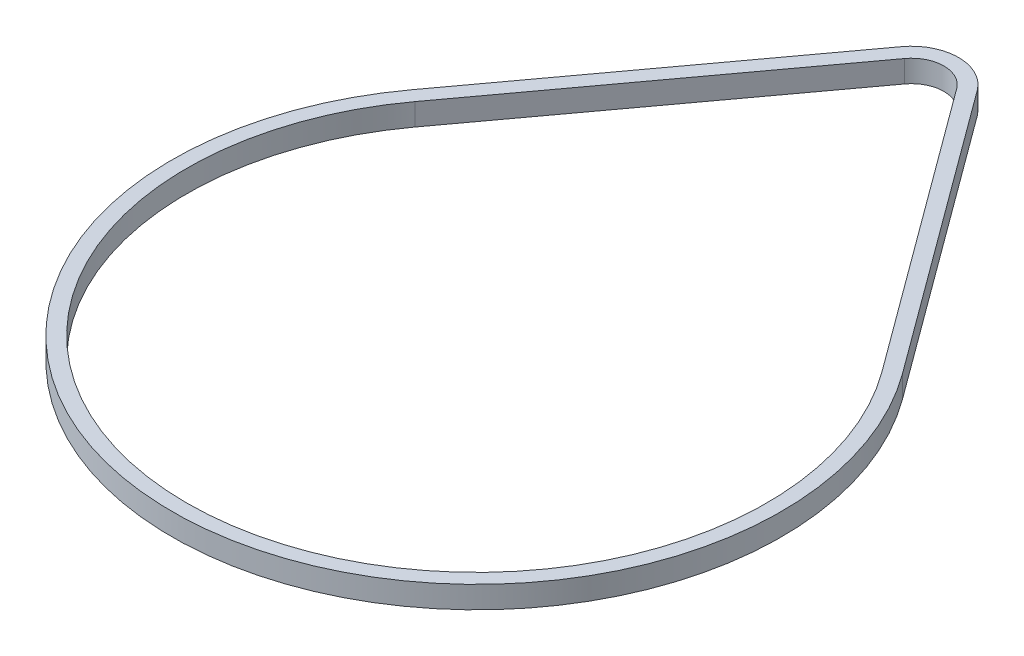
ISO-10303-21;
HEADER;
FILE_DESCRIPTION(('STEP AP214'),'2;1');
FILE_NAME('part.step','',(''),(''),'','','');
FILE_SCHEMA(('AUTOMOTIVE_DESIGN { 1 0 10303 214 1 1 1 1 }'));
ENDSEC;
DATA;
#1=APPLICATION_CONTEXT('core data for automotive mechanical design processes');
#2=APPLICATION_PROTOCOL_DEFINITION('international standard','automotive_design',2000,#1);
#3=PRODUCT_CONTEXT('',#1,'mechanical');
#4=PRODUCT('Part','Part','',(#3));
#5=PRODUCT_RELATED_PRODUCT_CATEGORY('part','',(#4));
#6=PRODUCT_DEFINITION_FORMATION('','',#4);
#7=PRODUCT_DEFINITION_CONTEXT('part definition',#1,'design');
#8=PRODUCT_DEFINITION('design','',#6,#7);
#9=PRODUCT_DEFINITION_SHAPE('','',#8);
#10=(LENGTH_UNIT() NAMED_UNIT(*) SI_UNIT(.MILLI.,.METRE.));
#11=(NAMED_UNIT(*) PLANE_ANGLE_UNIT() SI_UNIT($,.RADIAN.));
#12=(NAMED_UNIT(*) SI_UNIT($,.STERADIAN.) SOLID_ANGLE_UNIT());
#13=UNCERTAINTY_MEASURE_WITH_UNIT(LENGTH_MEASURE(1.E-05),#10,'distance_accuracy_value','');
#14=(GEOMETRIC_REPRESENTATION_CONTEXT(3) GLOBAL_UNCERTAINTY_ASSIGNED_CONTEXT((#13)) GLOBAL_UNIT_ASSIGNED_CONTEXT((#10,
#11,#12)) REPRESENTATION_CONTEXT('',''));
#15=CARTESIAN_POINT('',(0.,0.,0.));
#16=DIRECTION('',(0.,0.,1.));
#17=DIRECTION('',(1.,0.,0.));
#18=AXIS2_PLACEMENT_3D('',#15,#16,#17);
#19=CARTESIAN_POINT('',(0.,-4.5,-88.6925303685816));
#20=DIRECTION('',(0.,1.,0.));
#21=DIRECTION('',(0.,0.,1.));
#22=AXIS2_PLACEMENT_3D('',#19,#20,#21);
#23=PLANE('',#22);
#24=CARTESIAN_POINT('',(0.,-4.5,-88.6925303685816));
#25=DIRECTION('',(0.,-1.,0.));
#26=DIRECTION('',(0.,0.,-1.));
#27=AXIS2_PLACEMENT_3D('',#24,#25,#26);
#28=CIRCLE('',#27,13.1729422181366);
#29=CARTESIAN_POINT('',(10.611444809439,-4.5,-96.4978904332164));
#30=VERTEX_POINT('',#29);
#31=CARTESIAN_POINT('',(-10.611444809439,-4.5,-96.4978904332164));
#32=VERTEX_POINT('',#31);
#33=EDGE_CURVE('E111',#30,#32,#28,.F.);
#34=ORIENTED_EDGE('',*,*,#33,.T.);
#35=DIRECTION('',(0.592529742815413,0.,-0.805548573258684));
#36=VECTOR('',#35,1.);
#37=CARTESIAN_POINT('',(-10.611444809439,-4.5,-96.4978904332164));
#38=LINE('',#37,#36);
#39=CARTESIAN_POINT('',(-95.2793722653035,-4.5,18.6087839402397));
#40=VERTEX_POINT('',#39);
#41=EDGE_CURVE('E103',#40,#32,#38,.T.);
#42=ORIENTED_EDGE('',*,*,#41,.F.);
#43=CARTESIAN_POINT('',(0.,-4.5,88.6925303685816));
#44=DIRECTION('',(0.,-1.,0.));
#45=DIRECTION('',(0.,0.,-1.));
#46=AXIS2_PLACEMENT_3D('',#43,#44,#45);
#47=CIRCLE('',#46,118.278866636024);
#48=CARTESIAN_POINT('',(95.2793722653035,-4.5,18.6087839402397));
#49=VERTEX_POINT('',#48);
#50=EDGE_CURVE('E122',#40,#49,#47,.F.);
#51=ORIENTED_EDGE('',*,*,#50,.T.);
#52=DIRECTION('',(0.592529742815413,0.,0.805548573258684));
#53=VECTOR('',#52,1.);
#54=CARTESIAN_POINT('',(10.611444809439,-4.5,-96.4978904332164));
#55=LINE('',#54,#53);
#56=EDGE_CURVE('E108',#30,#49,#55,.T.);
#57=ORIENTED_EDGE('',*,*,#56,.F.);
#58=EDGE_LOOP('',(#34,#42,#51,#57));
#59=FACE_BOUND('',#58,.T.);
#60=DIRECTION('',(0.592529742815413,0.,0.805548573258684));
#61=VECTOR('',#60,1.);
#62=CARTESIAN_POINT('',(15.4402251769809,-4.5,-100.049750723549));
#63=LINE('',#62,#61);
#64=CARTESIAN_POINT('',(15.4402251769809,-4.5,-100.049750723549));
#65=VERTEX_POINT('',#64);
#66=CARTESIAN_POINT('',(100.108152632845,-4.5,15.056923649907));
#67=VERTEX_POINT('',#66);
#68=EDGE_CURVE('E107',#65,#67,#63,.T.);
#69=ORIENTED_EDGE('',*,*,#68,.T.);
#70=CARTESIAN_POINT('',(0.,-4.5,88.6925303685816));
#71=DIRECTION('',(0.,-1.,0.));
#72=DIRECTION('',(0.,0.,-1.));
#73=AXIS2_PLACEMENT_3D('',#70,#71,#72);
#74=CIRCLE('',#73,124.273266636024);
#75=CARTESIAN_POINT('',(-100.108152632845,-4.5,15.056923649907));
#76=VERTEX_POINT('',#75);
#77=EDGE_CURVE('E91',#76,#67,#74,.F.);
#78=ORIENTED_EDGE('',*,*,#77,.F.);
#79=DIRECTION('',(0.592529742815413,0.,-0.805548573258684));
#80=VECTOR('',#79,1.);
#81=CARTESIAN_POINT('',(-15.4402251769808,-4.5,-100.049750723549));
#82=LINE('',#81,#80);
#83=CARTESIAN_POINT('',(-15.4402251769808,-4.5,-100.049750723549));
#84=VERTEX_POINT('',#83);
#85=EDGE_CURVE('E90',#76,#84,#82,.T.);
#86=ORIENTED_EDGE('',*,*,#85,.T.);
#87=CARTESIAN_POINT('',(0.,-4.5,-88.6925303685816));
#88=DIRECTION('',(0.,-1.,0.));
#89=DIRECTION('',(0.,0.,-1.));
#90=AXIS2_PLACEMENT_3D('',#87,#88,#89);
#91=CIRCLE('',#90,19.1673422181366);
#92=EDGE_CURVE('E19',#65,#84,#91,.F.);
#93=ORIENTED_EDGE('',*,*,#92,.F.);
#94=EDGE_LOOP('',(#69,#78,#86,#93));
#95=FACE_BOUND('',#94,.T.);
#96=ADVANCED_FACE('F16',(#59,#95),#23,.F.);
#97=CARTESIAN_POINT('',(0.,4.5,-88.6925303685816));
#98=DIRECTION('',(0.,-1.,0.));
#99=DIRECTION('',(0.,0.,-1.));
#100=AXIS2_PLACEMENT_3D('',#97,#98,#99);
#101=CYLINDRICAL_SURFACE('',#100,19.1673422181366);
#102=ORIENTED_EDGE('',*,*,#92,.T.);
#103=DIRECTION('',(0.,1.,0.));
#104=VECTOR('',#103,1.);
#105=CARTESIAN_POINT('',(-15.4402251769808,4.5,-100.049750723549));
#106=LINE('',#105,#104);
#107=CARTESIAN_POINT('',(-15.4402251769808,4.5,-100.049750723549));
#108=VERTEX_POINT('',#107);
#109=EDGE_CURVE('E82',#84,#108,#106,.T.);
#110=ORIENTED_EDGE('',*,*,#109,.T.);
#111=CARTESIAN_POINT('',(0.,4.5,-88.6925303685816));
#112=DIRECTION('',(0.,-1.,0.));
#113=DIRECTION('',(0.,0.,-1.));
#114=AXIS2_PLACEMENT_3D('',#111,#112,#113);
#115=CIRCLE('',#114,19.1673422181366);
#116=CARTESIAN_POINT('',(15.4402251769809,4.5,-100.049750723549));
#117=VERTEX_POINT('',#116);
#118=EDGE_CURVE('E120',#117,#108,#115,.F.);
#119=ORIENTED_EDGE('',*,*,#118,.F.);
#120=DIRECTION('',(0.,1.,0.));
#121=VECTOR('',#120,1.);
#122=CARTESIAN_POINT('',(15.4402251769809,4.5,-100.049750723549));
#123=LINE('',#122,#121);
#124=EDGE_CURVE('E85',#117,#65,#123,.F.);
#125=ORIENTED_EDGE('',*,*,#124,.T.);
#126=EDGE_LOOP('',(#102,#110,#119,#125));
#127=FACE_BOUND('',#126,.T.);
#128=ADVANCED_FACE('F80',(#127),#101,.T.);
#129=CARTESIAN_POINT('',(-15.4402251769808,4.5,-100.049750723549));
#130=DIRECTION('',(0.805548573258684,0.,0.592529742815413));
#131=DIRECTION('',(0.592529742815413,0.,-0.805548573258684));
#132=AXIS2_PLACEMENT_3D('',#129,#130,#131);
#133=PLANE('',#132);
#134=DIRECTION('',(0.,-1.,0.));
#135=VECTOR('',#134,1.);
#136=CARTESIAN_POINT('',(-100.108152632845,4.5,15.0569236499071));
#137=LINE('',#136,#135);
#138=CARTESIAN_POINT('',(-100.108152632845,4.5,15.056923649907));
#139=VERTEX_POINT('',#138);
#140=EDGE_CURVE('E101',#139,#76,#137,.T.);
#141=ORIENTED_EDGE('',*,*,#140,.F.);
#142=DIRECTION('',(-0.592529742815413,0.,0.805548573258684));
#143=VECTOR('',#142,1.);
#144=CARTESIAN_POINT('',(-15.4402251769808,4.5,-100.049750723549));
#145=LINE('',#144,#143);
#146=EDGE_CURVE('E97',#108,#139,#145,.T.);
#147=ORIENTED_EDGE('',*,*,#146,.F.);
#148=ORIENTED_EDGE('',*,*,#109,.F.);
#149=ORIENTED_EDGE('',*,*,#85,.F.);
#150=EDGE_LOOP('',(#141,#147,#148,#149));
#151=FACE_BOUND('',#150,.T.);
#152=ADVANCED_FACE('F95',(#151),#133,.F.);
#153=CARTESIAN_POINT('',(0.,4.5,88.6925303685816));
#154=DIRECTION('',(0.,-1.,0.));
#155=DIRECTION('',(0.,0.,-1.));
#156=AXIS2_PLACEMENT_3D('',#153,#154,#155);
#157=CYLINDRICAL_SURFACE('',#156,124.273266636024);
#158=CARTESIAN_POINT('',(0.,4.5,88.6925303685816));
#159=DIRECTION('',(0.,-1.,0.));
#160=DIRECTION('',(0.,0.,-1.));
#161=AXIS2_PLACEMENT_3D('',#158,#159,#160);
#162=CIRCLE('',#161,124.273266636024);
#163=CARTESIAN_POINT('',(100.108152632845,4.5,15.056923649907));
#164=VERTEX_POINT('',#163);
#165=EDGE_CURVE('E116',#139,#164,#162,.F.);
#166=ORIENTED_EDGE('',*,*,#165,.F.);
#167=ORIENTED_EDGE('',*,*,#140,.T.);
#168=ORIENTED_EDGE('',*,*,#77,.T.);
#169=DIRECTION('',(0.,1.,0.));
#170=VECTOR('',#169,1.);
#171=CARTESIAN_POINT('',(100.108152632845,4.5,15.0569236499071));
#172=LINE('',#171,#170);
#173=EDGE_CURVE('E127',#67,#164,#172,.T.);
#174=ORIENTED_EDGE('',*,*,#173,.T.);
#175=EDGE_LOOP('',(#166,#167,#168,#174));
#176=FACE_BOUND('',#175,.T.);
#177=ADVANCED_FACE('F179',(#176),#157,.T.);
#178=CARTESIAN_POINT('',(15.4402251769809,4.5,-100.049750723549));
#179=DIRECTION('',(-0.805548573258684,0.,0.592529742815413));
#180=DIRECTION('',(0.592529742815413,0.,0.805548573258684));
#181=AXIS2_PLACEMENT_3D('',#178,#179,#180);
#182=PLANE('',#181);
#183=ORIENTED_EDGE('',*,*,#124,.F.);
#184=DIRECTION('',(-0.592529742815412,0.,-0.805548573258684));
#185=VECTOR('',#184,1.);
#186=CARTESIAN_POINT('',(100.108152632845,4.5,15.056923649907));
#187=LINE('',#186,#185);
#188=EDGE_CURVE('E119',#164,#117,#187,.T.);
#189=ORIENTED_EDGE('',*,*,#188,.F.);
#190=ORIENTED_EDGE('',*,*,#173,.F.);
#191=ORIENTED_EDGE('',*,*,#68,.F.);
#192=EDGE_LOOP('',(#183,#189,#190,#191));
#193=FACE_BOUND('',#192,.T.);
#194=ADVANCED_FACE('F176',(#193),#182,.F.);
#195=CARTESIAN_POINT('',(-10.611444809439,4.5,-96.4978904332164));
#196=DIRECTION('',(0.805548573258684,0.,0.592529742815413));
#197=DIRECTION('',(0.592529742815413,0.,-0.805548573258684));
#198=AXIS2_PLACEMENT_3D('',#195,#196,#197);
#199=PLANE('',#198);
#200=DIRECTION('',(0.592529742815413,0.,-0.805548573258684));
#201=VECTOR('',#200,1.);
#202=CARTESIAN_POINT('',(-95.2793722653035,4.5,18.6087839402397));
#203=LINE('',#202,#201);
#204=CARTESIAN_POINT('',(-95.2793722653035,4.5,18.6087839402397));
#205=VERTEX_POINT('',#204);
#206=CARTESIAN_POINT('',(-10.611444809439,4.5,-96.4978904332164));
#207=VERTEX_POINT('',#206);
#208=EDGE_CURVE('E115',#205,#207,#203,.T.);
#209=ORIENTED_EDGE('',*,*,#208,.F.);
#210=DIRECTION('',(0.,-1.,0.));
#211=VECTOR('',#210,1.);
#212=CARTESIAN_POINT('',(-95.2793722653035,4.5,18.6087839402398));
#213=LINE('',#212,#211);
#214=EDGE_CURVE('E125',#205,#40,#213,.T.);
#215=ORIENTED_EDGE('',*,*,#214,.T.);
#216=ORIENTED_EDGE('',*,*,#41,.T.);
#217=DIRECTION('',(0.,-1.,0.));
#218=VECTOR('',#217,1.);
#219=CARTESIAN_POINT('',(-10.611444809439,4.5,-96.4978904332164));
#220=LINE('',#219,#218);
#221=EDGE_CURVE('E106',#32,#207,#220,.F.);
#222=ORIENTED_EDGE('',*,*,#221,.T.);
#223=EDGE_LOOP('',(#209,#215,#216,#222));
#224=FACE_BOUND('',#223,.T.);
#225=ADVANCED_FACE('F157',(#224),#199,.T.);
#226=CARTESIAN_POINT('',(0.,4.5,-88.6925303685816));
#227=DIRECTION('',(0.,-1.,0.));
#228=DIRECTION('',(0.,0.,-1.));
#229=AXIS2_PLACEMENT_3D('',#226,#227,#228);
#230=CYLINDRICAL_SURFACE('',#229,13.1729422181366);
#231=DIRECTION('',(0.,1.,0.));
#232=VECTOR('',#231,1.);
#233=CARTESIAN_POINT('',(10.611444809439,4.5,-96.4978904332164));
#234=LINE('',#233,#232);
#235=CARTESIAN_POINT('',(10.611444809439,4.5,-96.4978904332164));
#236=VERTEX_POINT('',#235);
#237=EDGE_CURVE('E110',#236,#30,#234,.F.);
#238=ORIENTED_EDGE('',*,*,#237,.F.);
#239=CARTESIAN_POINT('',(0.,4.5,-88.6925303685816));
#240=DIRECTION('',(0.,-1.,0.));
#241=DIRECTION('',(0.,0.,-1.));
#242=AXIS2_PLACEMENT_3D('',#239,#240,#241);
#243=CIRCLE('',#242,13.1729422181366);
#244=EDGE_CURVE('E113',#207,#236,#243,.T.);
#245=ORIENTED_EDGE('',*,*,#244,.F.);
#246=ORIENTED_EDGE('',*,*,#221,.F.);
#247=ORIENTED_EDGE('',*,*,#33,.F.);
#248=EDGE_LOOP('',(#238,#245,#246,#247));
#249=FACE_BOUND('',#248,.T.);
#250=ADVANCED_FACE('F153',(#249),#230,.F.);
#251=CARTESIAN_POINT('',(10.611444809439,4.5,-96.4978904332164));
#252=DIRECTION('',(-0.805548573258684,0.,0.592529742815413));
#253=DIRECTION('',(0.592529742815413,0.,0.805548573258684));
#254=AXIS2_PLACEMENT_3D('',#251,#252,#253);
#255=PLANE('',#254);
#256=DIRECTION('',(0.592529742815412,0.,0.805548573258684));
#257=VECTOR('',#256,1.);
#258=CARTESIAN_POINT('',(10.611444809439,4.5,-96.4978904332164));
#259=LINE('',#258,#257);
#260=CARTESIAN_POINT('',(95.2793722653035,4.5,18.6087839402397));
#261=VERTEX_POINT('',#260);
#262=EDGE_CURVE('E25',#236,#261,#259,.T.);
#263=ORIENTED_EDGE('',*,*,#262,.F.);
#264=ORIENTED_EDGE('',*,*,#237,.T.);
#265=ORIENTED_EDGE('',*,*,#56,.T.);
#266=DIRECTION('',(0.,-1.,0.));
#267=VECTOR('',#266,1.);
#268=CARTESIAN_POINT('',(95.2793722653035,4.5,18.6087839402397));
#269=LINE('',#268,#267);
#270=EDGE_CURVE('E34',#49,#261,#269,.F.);
#271=ORIENTED_EDGE('',*,*,#270,.T.);
#272=EDGE_LOOP('',(#263,#264,#265,#271));
#273=FACE_BOUND('',#272,.T.);
#274=ADVANCED_FACE('F150',(#273),#255,.T.);
#275=CARTESIAN_POINT('',(0.,4.5,88.6925303685816));
#276=DIRECTION('',(0.,-1.,0.));
#277=DIRECTION('',(0.,0.,-1.));
#278=AXIS2_PLACEMENT_3D('',#275,#276,#277);
#279=CYLINDRICAL_SURFACE('',#278,118.278866636024);
#280=ORIENTED_EDGE('',*,*,#214,.F.);
#281=CARTESIAN_POINT('',(0.,4.5,88.6925303685816));
#282=DIRECTION('',(0.,-1.,0.));
#283=DIRECTION('',(0.,0.,-1.));
#284=AXIS2_PLACEMENT_3D('',#281,#282,#283);
#285=CIRCLE('',#284,118.278866636024);
#286=EDGE_CURVE('E11',#261,#205,#285,.T.);
#287=ORIENTED_EDGE('',*,*,#286,.F.);
#288=ORIENTED_EDGE('',*,*,#270,.F.);
#289=ORIENTED_EDGE('',*,*,#50,.F.);
#290=EDGE_LOOP('',(#280,#287,#288,#289));
#291=FACE_BOUND('',#290,.T.);
#292=ADVANCED_FACE('F161',(#291),#279,.F.);
#293=CARTESIAN_POINT('',(0.,4.5,-88.6925303685816));
#294=DIRECTION('',(0.,1.,0.));
#295=DIRECTION('',(0.,0.,1.));
#296=AXIS2_PLACEMENT_3D('',#293,#294,#295);
#297=PLANE('',#296);
#298=ORIENTED_EDGE('',*,*,#262,.T.);
#299=ORIENTED_EDGE('',*,*,#286,.T.);
#300=ORIENTED_EDGE('',*,*,#208,.T.);
#301=ORIENTED_EDGE('',*,*,#244,.T.);
#302=EDGE_LOOP('',(#298,#299,#300,#301));
#303=FACE_BOUND('',#302,.T.);
#304=ORIENTED_EDGE('',*,*,#165,.T.);
#305=ORIENTED_EDGE('',*,*,#188,.T.);
#306=ORIENTED_EDGE('',*,*,#118,.T.);
#307=ORIENTED_EDGE('',*,*,#146,.T.);
#308=EDGE_LOOP('',(#304,#305,#306,#307));
#309=FACE_BOUND('',#308,.T.);
#310=ADVANCED_FACE('F146',(#303,#309),#297,.T.);
#311=CLOSED_SHELL('',(#96,#128,#152,#177,#194,#225,#250,#274,#292,#310));
#312=MANIFOLD_SOLID_BREP('B1',#311);
#313=ADVANCED_BREP_SHAPE_REPRESENTATION('',(#18,#312),#14);
#314=SHAPE_DEFINITION_REPRESENTATION(#9,#313);
ENDSEC;
END-ISO-10303-21;
